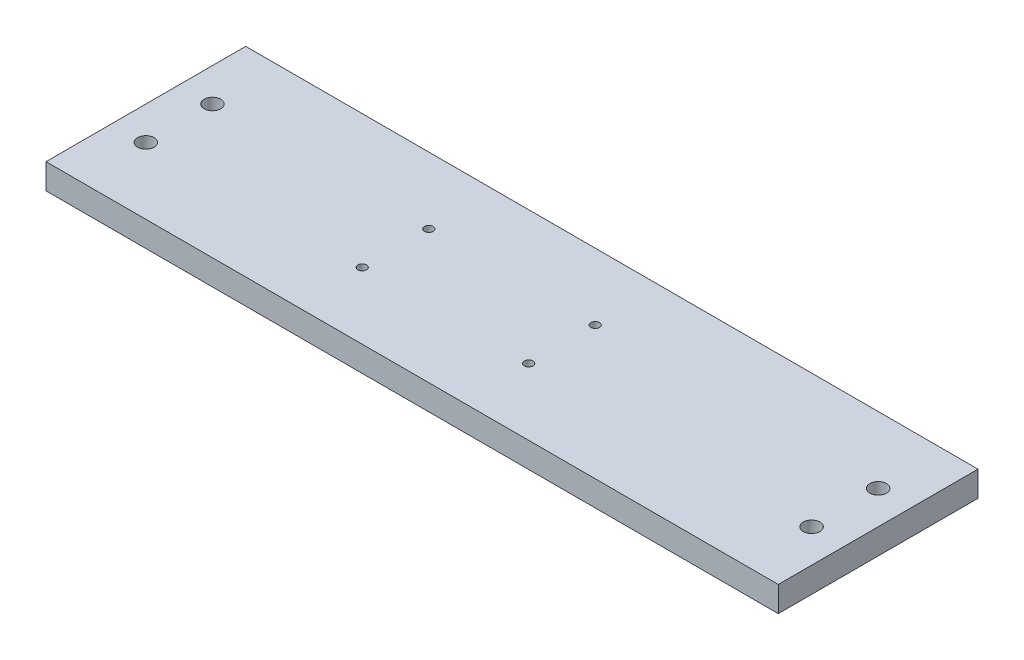
ISO-10303-21;
HEADER;
FILE_DESCRIPTION(('STEP AP214'),'2;1');
FILE_NAME('part.step','',(''),(''),'','','');
FILE_SCHEMA(('AUTOMOTIVE_DESIGN { 1 0 10303 214 1 1 1 1 }'));
ENDSEC;
DATA;
#1=APPLICATION_CONTEXT('core data for automotive mechanical design processes');
#2=APPLICATION_PROTOCOL_DEFINITION('international standard','automotive_design',2000,#1);
#3=PRODUCT_CONTEXT('',#1,'mechanical');
#4=PRODUCT('Part','Part','',(#3));
#5=PRODUCT_RELATED_PRODUCT_CATEGORY('part','',(#4));
#6=PRODUCT_DEFINITION_FORMATION('','',#4);
#7=PRODUCT_DEFINITION_CONTEXT('part definition',#1,'design');
#8=PRODUCT_DEFINITION('design','',#6,#7);
#9=PRODUCT_DEFINITION_SHAPE('','',#8);
#10=(LENGTH_UNIT() NAMED_UNIT(*) SI_UNIT(.MILLI.,.METRE.));
#11=(NAMED_UNIT(*) PLANE_ANGLE_UNIT() SI_UNIT($,.RADIAN.));
#12=(NAMED_UNIT(*) SI_UNIT($,.STERADIAN.) SOLID_ANGLE_UNIT());
#13=UNCERTAINTY_MEASURE_WITH_UNIT(LENGTH_MEASURE(1.E-05),#10,'distance_accuracy_value','');
#14=(GEOMETRIC_REPRESENTATION_CONTEXT(3) GLOBAL_UNCERTAINTY_ASSIGNED_CONTEXT((#13)) GLOBAL_UNIT_ASSIGNED_CONTEXT((#10,
#11,#12)) REPRESENTATION_CONTEXT('',''));
#15=CARTESIAN_POINT('',(0.,0.,0.));
#16=DIRECTION('',(0.,0.,1.));
#17=DIRECTION('',(1.,0.,0.));
#18=AXIS2_PLACEMENT_3D('',#15,#16,#17);
#19=CARTESIAN_POINT('',(0.,4.826,0.));
#20=DIRECTION('',(0.,-1.,0.));
#21=DIRECTION('',(0.,0.,-1.));
#22=AXIS2_PLACEMENT_3D('',#19,#20,#21);
#23=PLANE('',#22);
#24=DIRECTION('',(0.,0.,1.));
#25=VECTOR('',#24,1.);
#26=CARTESIAN_POINT('',(-139.7,4.826,-38.1));
#27=LINE('',#26,#25);
#28=CARTESIAN_POINT('',(-139.7,4.826,-38.1));
#29=VERTEX_POINT('',#28);
#30=CARTESIAN_POINT('',(-139.7,4.826,38.1));
#31=VERTEX_POINT('',#30);
#32=EDGE_CURVE('E91',#29,#31,#27,.T.);
#33=ORIENTED_EDGE('',*,*,#32,.T.);
#34=DIRECTION('',(1.,0.,0.));
#35=VECTOR('',#34,1.);
#36=CARTESIAN_POINT('',(139.7,4.826,38.1));
#37=LINE('',#36,#35);
#38=CARTESIAN_POINT('',(139.7,4.826,38.1));
#39=VERTEX_POINT('',#38);
#40=EDGE_CURVE('E86',#31,#39,#37,.T.);
#41=ORIENTED_EDGE('',*,*,#40,.T.);
#42=DIRECTION('',(0.,0.,-1.));
#43=VECTOR('',#42,1.);
#44=CARTESIAN_POINT('',(139.7,4.826,-38.1));
#45=LINE('',#44,#43);
#46=CARTESIAN_POINT('',(139.7,4.826,-38.1));
#47=VERTEX_POINT('',#46);
#48=EDGE_CURVE('E87',#39,#47,#45,.T.);
#49=ORIENTED_EDGE('',*,*,#48,.T.);
#50=DIRECTION('',(-1.,0.,0.));
#51=VECTOR('',#50,1.);
#52=CARTESIAN_POINT('',(139.7,4.826,-38.1));
#53=LINE('',#52,#51);
#54=EDGE_CURVE('E57',#47,#29,#53,.T.);
#55=ORIENTED_EDGE('',*,*,#54,.T.);
#56=EDGE_LOOP('',(#33,#41,#49,#55));
#57=FACE_BOUND('',#56,.T.);
#58=CARTESIAN_POINT('',(127.,4.826,-12.7));
#59=DIRECTION('',(0.,1.,0.));
#60=DIRECTION('',(0.,0.,1.));
#61=AXIS2_PLACEMENT_3D('',#58,#59,#60);
#62=CIRCLE('',#61,3.175);
#63=CARTESIAN_POINT('',(127.,4.826,-9.525));
#64=VERTEX_POINT('',#63);
#65=EDGE_CURVE('E106',#64,#64,#62,.T.);
#66=ORIENTED_EDGE('',*,*,#65,.F.);
#67=EDGE_LOOP('',(#66));
#68=FACE_BOUND('',#67,.T.);
#69=CARTESIAN_POINT('',(19.05,4.826,-12.7));
#70=DIRECTION('',(0.,1.,0.));
#71=DIRECTION('',(0.,0.,1.));
#72=AXIS2_PLACEMENT_3D('',#69,#70,#71);
#73=CIRCLE('',#72,1.651);
#74=CARTESIAN_POINT('',(19.05,4.826,-11.049));
#75=VERTEX_POINT('',#74);
#76=EDGE_CURVE('E123',#75,#75,#73,.T.);
#77=ORIENTED_EDGE('',*,*,#76,.F.);
#78=EDGE_LOOP('',(#77));
#79=FACE_BOUND('',#78,.T.);
#80=CARTESIAN_POINT('',(-44.45,4.826,-12.7));
#81=DIRECTION('',(0.,1.,0.));
#82=DIRECTION('',(0.,0.,1.));
#83=AXIS2_PLACEMENT_3D('',#80,#81,#82);
#84=CIRCLE('',#83,1.651);
#85=CARTESIAN_POINT('',(-44.45,4.826,-11.049));
#86=VERTEX_POINT('',#85);
#87=EDGE_CURVE('E130',#86,#86,#84,.T.);
#88=ORIENTED_EDGE('',*,*,#87,.F.);
#89=EDGE_LOOP('',(#88));
#90=FACE_BOUND('',#89,.T.);
#91=CARTESIAN_POINT('',(-127.,4.826,-12.7));
#92=DIRECTION('',(0.,1.,0.));
#93=DIRECTION('',(0.,0.,1.));
#94=AXIS2_PLACEMENT_3D('',#91,#92,#93);
#95=CIRCLE('',#94,3.175);
#96=CARTESIAN_POINT('',(-127.,4.826,-9.52499999999999));
#97=VERTEX_POINT('',#96);
#98=EDGE_CURVE('E133',#97,#97,#95,.T.);
#99=ORIENTED_EDGE('',*,*,#98,.F.);
#100=EDGE_LOOP('',(#99));
#101=FACE_BOUND('',#100,.T.);
#102=CARTESIAN_POINT('',(127.,4.826,12.7));
#103=DIRECTION('',(0.,1.,0.));
#104=DIRECTION('',(0.,0.,-1.));
#105=AXIS2_PLACEMENT_3D('',#102,#103,#104);
#106=CIRCLE('',#105,3.175);
#107=CARTESIAN_POINT('',(127.,4.826,9.525));
#108=VERTEX_POINT('',#107);
#109=EDGE_CURVE('E137',#108,#108,#106,.T.);
#110=ORIENTED_EDGE('',*,*,#109,.F.);
#111=EDGE_LOOP('',(#110));
#112=FACE_BOUND('',#111,.T.);
#113=CARTESIAN_POINT('',(19.05,4.826,12.7));
#114=DIRECTION('',(0.,1.,0.));
#115=DIRECTION('',(0.,0.,-1.));
#116=AXIS2_PLACEMENT_3D('',#113,#114,#115);
#117=CIRCLE('',#116,1.651);
#118=CARTESIAN_POINT('',(19.05,4.826,11.049));
#119=VERTEX_POINT('',#118);
#120=EDGE_CURVE('E144',#119,#119,#117,.T.);
#121=ORIENTED_EDGE('',*,*,#120,.F.);
#122=EDGE_LOOP('',(#121));
#123=FACE_BOUND('',#122,.T.);
#124=CARTESIAN_POINT('',(-44.45,4.826,12.7));
#125=DIRECTION('',(0.,1.,0.));
#126=DIRECTION('',(0.,0.,-1.));
#127=AXIS2_PLACEMENT_3D('',#124,#125,#126);
#128=CIRCLE('',#127,1.651);
#129=CARTESIAN_POINT('',(-44.45,4.826,11.049));
#130=VERTEX_POINT('',#129);
#131=EDGE_CURVE('E151',#130,#130,#128,.T.);
#132=ORIENTED_EDGE('',*,*,#131,.F.);
#133=EDGE_LOOP('',(#132));
#134=FACE_BOUND('',#133,.T.);
#135=CARTESIAN_POINT('',(-127.,4.826,12.7));
#136=DIRECTION('',(0.,1.,0.));
#137=DIRECTION('',(0.,0.,-1.));
#138=AXIS2_PLACEMENT_3D('',#135,#136,#137);
#139=CIRCLE('',#138,3.175);
#140=CARTESIAN_POINT('',(-127.,4.826,9.52499999999999));
#141=VERTEX_POINT('',#140);
#142=EDGE_CURVE('E160',#141,#141,#139,.T.);
#143=ORIENTED_EDGE('',*,*,#142,.F.);
#144=EDGE_LOOP('',(#143));
#145=FACE_BOUND('',#144,.T.);
#146=ADVANCED_FACE('F39',(#57,#68,#79,#90,#101,#112,#123,#134,#145),#23,.F.);
#147=CARTESIAN_POINT('',(0.,-4.826,0.));
#148=DIRECTION('',(0.,-1.,0.));
#149=DIRECTION('',(0.,0.,-1.));
#150=AXIS2_PLACEMENT_3D('',#147,#148,#149);
#151=PLANE('',#150);
#152=CARTESIAN_POINT('',(-44.45,-4.826,12.7));
#153=DIRECTION('',(0.,1.,0.));
#154=DIRECTION('',(0.,0.,-1.));
#155=AXIS2_PLACEMENT_3D('',#152,#153,#154);
#156=CIRCLE('',#155,1.651);
#157=CARTESIAN_POINT('',(-44.45,-4.826,11.049));
#158=VERTEX_POINT('',#157);
#159=EDGE_CURVE('E153',#158,#158,#156,.T.);
#160=ORIENTED_EDGE('',*,*,#159,.T.);
#161=EDGE_LOOP('',(#160));
#162=FACE_BOUND('',#161,.T.);
#163=CARTESIAN_POINT('',(127.,-4.826,12.7));
#164=DIRECTION('',(0.,1.,0.));
#165=DIRECTION('',(0.,0.,-1.));
#166=AXIS2_PLACEMENT_3D('',#163,#164,#165);
#167=CIRCLE('',#166,3.175);
#168=CARTESIAN_POINT('',(127.,-4.826,9.525));
#169=VERTEX_POINT('',#168);
#170=EDGE_CURVE('E145',#169,#169,#167,.T.);
#171=ORIENTED_EDGE('',*,*,#170,.T.);
#172=EDGE_LOOP('',(#171));
#173=FACE_BOUND('',#172,.T.);
#174=CARTESIAN_POINT('',(-44.45,-4.826,-12.7));
#175=DIRECTION('',(0.,1.,0.));
#176=DIRECTION('',(0.,0.,1.));
#177=AXIS2_PLACEMENT_3D('',#174,#175,#176);
#178=CIRCLE('',#177,1.651);
#179=CARTESIAN_POINT('',(-44.45,-4.826,-11.049));
#180=VERTEX_POINT('',#179);
#181=EDGE_CURVE('E127',#180,#180,#178,.T.);
#182=ORIENTED_EDGE('',*,*,#181,.T.);
#183=EDGE_LOOP('',(#182));
#184=FACE_BOUND('',#183,.T.);
#185=CARTESIAN_POINT('',(127.,-4.826,-12.7));
#186=DIRECTION('',(0.,1.,0.));
#187=DIRECTION('',(0.,0.,1.));
#188=AXIS2_PLACEMENT_3D('',#185,#186,#187);
#189=CIRCLE('',#188,3.175);
#190=CARTESIAN_POINT('',(127.,-4.826,-9.525));
#191=VERTEX_POINT('',#190);
#192=EDGE_CURVE('E119',#191,#191,#189,.T.);
#193=ORIENTED_EDGE('',*,*,#192,.T.);
#194=EDGE_LOOP('',(#193));
#195=FACE_BOUND('',#194,.T.);
#196=DIRECTION('',(0.,0.,1.));
#197=VECTOR('',#196,1.);
#198=CARTESIAN_POINT('',(-139.7,-4.826,-38.1));
#199=LINE('',#198,#197);
#200=CARTESIAN_POINT('',(-139.7,-4.826,-38.1));
#201=VERTEX_POINT('',#200);
#202=CARTESIAN_POINT('',(-139.7,-4.826,38.1));
#203=VERTEX_POINT('',#202);
#204=EDGE_CURVE('E104',#201,#203,#199,.T.);
#205=ORIENTED_EDGE('',*,*,#204,.F.);
#206=DIRECTION('',(-1.,0.,0.));
#207=VECTOR('',#206,1.);
#208=CARTESIAN_POINT('',(139.7,-4.826,-38.1));
#209=LINE('',#208,#207);
#210=CARTESIAN_POINT('',(139.7,-4.826,-38.1));
#211=VERTEX_POINT('',#210);
#212=EDGE_CURVE('E80',#211,#201,#209,.T.);
#213=ORIENTED_EDGE('',*,*,#212,.F.);
#214=DIRECTION('',(0.,0.,-1.));
#215=VECTOR('',#214,1.);
#216=CARTESIAN_POINT('',(139.7,-4.826,-38.1));
#217=LINE('',#216,#215);
#218=CARTESIAN_POINT('',(139.7,-4.826,38.1));
#219=VERTEX_POINT('',#218);
#220=EDGE_CURVE('E74',#219,#211,#217,.T.);
#221=ORIENTED_EDGE('',*,*,#220,.F.);
#222=DIRECTION('',(1.,0.,0.));
#223=VECTOR('',#222,1.);
#224=CARTESIAN_POINT('',(139.7,-4.826,38.1));
#225=LINE('',#224,#223);
#226=EDGE_CURVE('E94',#203,#219,#225,.T.);
#227=ORIENTED_EDGE('',*,*,#226,.F.);
#228=EDGE_LOOP('',(#205,#213,#221,#227));
#229=FACE_BOUND('',#228,.T.);
#230=CARTESIAN_POINT('',(19.05,-4.826,-12.7));
#231=DIRECTION('',(0.,1.,0.));
#232=DIRECTION('',(0.,0.,1.));
#233=AXIS2_PLACEMENT_3D('',#230,#231,#232);
#234=CIRCLE('',#233,1.651);
#235=CARTESIAN_POINT('',(19.05,-4.826,-11.049));
#236=VERTEX_POINT('',#235);
#237=EDGE_CURVE('E125',#236,#236,#234,.T.);
#238=ORIENTED_EDGE('',*,*,#237,.T.);
#239=EDGE_LOOP('',(#238));
#240=FACE_BOUND('',#239,.T.);
#241=CARTESIAN_POINT('',(-127.,-4.826,-12.7));
#242=DIRECTION('',(0.,1.,0.));
#243=DIRECTION('',(0.,0.,1.));
#244=AXIS2_PLACEMENT_3D('',#241,#242,#243);
#245=CIRCLE('',#244,3.175);
#246=CARTESIAN_POINT('',(-127.,-4.826,-9.52499999999999));
#247=VERTEX_POINT('',#246);
#248=EDGE_CURVE('E136',#247,#247,#245,.T.);
#249=ORIENTED_EDGE('',*,*,#248,.T.);
#250=EDGE_LOOP('',(#249));
#251=FACE_BOUND('',#250,.T.);
#252=CARTESIAN_POINT('',(19.05,-4.826,12.7));
#253=DIRECTION('',(0.,1.,0.));
#254=DIRECTION('',(0.,0.,-1.));
#255=AXIS2_PLACEMENT_3D('',#252,#253,#254);
#256=CIRCLE('',#255,1.651);
#257=CARTESIAN_POINT('',(19.05,-4.826,11.049));
#258=VERTEX_POINT('',#257);
#259=EDGE_CURVE('E149',#258,#258,#256,.T.);
#260=ORIENTED_EDGE('',*,*,#259,.T.);
#261=EDGE_LOOP('',(#260));
#262=FACE_BOUND('',#261,.T.);
#263=CARTESIAN_POINT('',(-127.,-4.826,12.7));
#264=DIRECTION('',(0.,1.,0.));
#265=DIRECTION('',(0.,0.,-1.));
#266=AXIS2_PLACEMENT_3D('',#263,#264,#265);
#267=CIRCLE('',#266,3.175);
#268=CARTESIAN_POINT('',(-127.,-4.826,9.52499999999999));
#269=VERTEX_POINT('',#268);
#270=EDGE_CURVE('E158',#269,#269,#267,.T.);
#271=ORIENTED_EDGE('',*,*,#270,.T.);
#272=EDGE_LOOP('',(#271));
#273=FACE_BOUND('',#272,.T.);
#274=ADVANCED_FACE('F114',(#162,#173,#184,#195,#229,#240,#251,#262,#273),#151,.T.);
#275=CARTESIAN_POINT('',(-139.7,4.826,-38.1));
#276=DIRECTION('',(1.,0.,0.));
#277=DIRECTION('',(0.,0.,-1.));
#278=AXIS2_PLACEMENT_3D('',#275,#276,#277);
#279=PLANE('',#278);
#280=ORIENTED_EDGE('',*,*,#204,.T.);
#281=DIRECTION('',(0.,-1.,0.));
#282=VECTOR('',#281,1.);
#283=CARTESIAN_POINT('',(-139.7,4.826,38.1));
#284=LINE('',#283,#282);
#285=EDGE_CURVE('E11',#31,#203,#284,.T.);
#286=ORIENTED_EDGE('',*,*,#285,.F.);
#287=ORIENTED_EDGE('',*,*,#32,.F.);
#288=DIRECTION('',(0.,-1.,0.));
#289=VECTOR('',#288,1.);
#290=CARTESIAN_POINT('',(-139.7,4.826,-38.1));
#291=LINE('',#290,#289);
#292=EDGE_CURVE('E98',#29,#201,#291,.T.);
#293=ORIENTED_EDGE('',*,*,#292,.T.);
#294=EDGE_LOOP('',(#280,#286,#287,#293));
#295=FACE_BOUND('',#294,.T.);
#296=ADVANCED_FACE('F41',(#295),#279,.F.);
#297=CARTESIAN_POINT('',(139.7,4.826,38.1));
#298=DIRECTION('',(0.,0.,-1.));
#299=DIRECTION('',(-1.,0.,0.));
#300=AXIS2_PLACEMENT_3D('',#297,#298,#299);
#301=PLANE('',#300);
#302=ORIENTED_EDGE('',*,*,#226,.T.);
#303=DIRECTION('',(0.,-1.,0.));
#304=VECTOR('',#303,1.);
#305=CARTESIAN_POINT('',(139.7,4.826,38.1));
#306=LINE('',#305,#304);
#307=EDGE_CURVE('E48',#39,#219,#306,.T.);
#308=ORIENTED_EDGE('',*,*,#307,.F.);
#309=ORIENTED_EDGE('',*,*,#40,.F.);
#310=ORIENTED_EDGE('',*,*,#285,.T.);
#311=EDGE_LOOP('',(#302,#308,#309,#310));
#312=FACE_BOUND('',#311,.T.);
#313=ADVANCED_FACE('F92',(#312),#301,.F.);
#314=CARTESIAN_POINT('',(139.7,4.826,-38.1));
#315=DIRECTION('',(-1.,0.,0.));
#316=DIRECTION('',(0.,0.,1.));
#317=AXIS2_PLACEMENT_3D('',#314,#315,#316);
#318=PLANE('',#317);
#319=ORIENTED_EDGE('',*,*,#220,.T.);
#320=DIRECTION('',(0.,-1.,0.));
#321=VECTOR('',#320,1.);
#322=CARTESIAN_POINT('',(139.7,4.826,-38.1));
#323=LINE('',#322,#321);
#324=EDGE_CURVE('E96',#47,#211,#323,.T.);
#325=ORIENTED_EDGE('',*,*,#324,.F.);
#326=ORIENTED_EDGE('',*,*,#48,.F.);
#327=ORIENTED_EDGE('',*,*,#307,.T.);
#328=EDGE_LOOP('',(#319,#325,#326,#327));
#329=FACE_BOUND('',#328,.T.);
#330=ADVANCED_FACE('F100',(#329),#318,.F.);
#331=CARTESIAN_POINT('',(139.7,4.826,-38.1));
#332=DIRECTION('',(0.,0.,1.));
#333=DIRECTION('',(1.,0.,0.));
#334=AXIS2_PLACEMENT_3D('',#331,#332,#333);
#335=PLANE('',#334);
#336=ORIENTED_EDGE('',*,*,#212,.T.);
#337=ORIENTED_EDGE('',*,*,#292,.F.);
#338=ORIENTED_EDGE('',*,*,#54,.F.);
#339=ORIENTED_EDGE('',*,*,#324,.T.);
#340=EDGE_LOOP('',(#336,#337,#338,#339));
#341=FACE_BOUND('',#340,.T.);
#342=ADVANCED_FACE('F112',(#341),#335,.F.);
#343=CARTESIAN_POINT('',(127.,4.826,-12.7));
#344=DIRECTION('',(0.,-1.,0.));
#345=DIRECTION('',(0.,0.,-1.));
#346=AXIS2_PLACEMENT_3D('',#343,#344,#345);
#347=CYLINDRICAL_SURFACE('',#346,3.175);
#348=ORIENTED_EDGE('',*,*,#65,.T.);
#349=EDGE_LOOP('',(#348));
#350=FACE_BOUND('',#349,.T.);
#351=ORIENTED_EDGE('',*,*,#192,.F.);
#352=EDGE_LOOP('',(#351));
#353=FACE_BOUND('',#352,.T.);
#354=ADVANCED_FACE('F180',(#350,#353),#347,.F.);
#355=CARTESIAN_POINT('',(19.05,4.826,-12.7));
#356=DIRECTION('',(0.,-1.,0.));
#357=DIRECTION('',(0.,0.,-1.));
#358=AXIS2_PLACEMENT_3D('',#355,#356,#357);
#359=CYLINDRICAL_SURFACE('',#358,1.651);
#360=ORIENTED_EDGE('',*,*,#76,.T.);
#361=EDGE_LOOP('',(#360));
#362=FACE_BOUND('',#361,.T.);
#363=ORIENTED_EDGE('',*,*,#237,.F.);
#364=EDGE_LOOP('',(#363));
#365=FACE_BOUND('',#364,.T.);
#366=ADVANCED_FACE('F225',(#362,#365),#359,.F.);
#367=CARTESIAN_POINT('',(-44.45,4.826,-12.7));
#368=DIRECTION('',(0.,-1.,0.));
#369=DIRECTION('',(0.,0.,-1.));
#370=AXIS2_PLACEMENT_3D('',#367,#368,#369);
#371=CYLINDRICAL_SURFACE('',#370,1.651);
#372=ORIENTED_EDGE('',*,*,#87,.T.);
#373=EDGE_LOOP('',(#372));
#374=FACE_BOUND('',#373,.T.);
#375=ORIENTED_EDGE('',*,*,#181,.F.);
#376=EDGE_LOOP('',(#375));
#377=FACE_BOUND('',#376,.T.);
#378=ADVANCED_FACE('F229',(#374,#377),#371,.F.);
#379=CARTESIAN_POINT('',(-127.,4.826,-12.7));
#380=DIRECTION('',(0.,-1.,0.));
#381=DIRECTION('',(0.,0.,-1.));
#382=AXIS2_PLACEMENT_3D('',#379,#380,#381);
#383=CYLINDRICAL_SURFACE('',#382,3.175);
#384=ORIENTED_EDGE('',*,*,#98,.T.);
#385=EDGE_LOOP('',(#384));
#386=FACE_BOUND('',#385,.T.);
#387=ORIENTED_EDGE('',*,*,#248,.F.);
#388=EDGE_LOOP('',(#387));
#389=FACE_BOUND('',#388,.T.);
#390=ADVANCED_FACE('F239',(#386,#389),#383,.F.);
#391=CARTESIAN_POINT('',(127.,4.826,12.7));
#392=DIRECTION('',(0.,-1.,0.));
#393=DIRECTION('',(0.,0.,-1.));
#394=AXIS2_PLACEMENT_3D('',#391,#392,#393);
#395=CYLINDRICAL_SURFACE('',#394,3.175);
#396=ORIENTED_EDGE('',*,*,#109,.T.);
#397=EDGE_LOOP('',(#396));
#398=FACE_BOUND('',#397,.T.);
#399=ORIENTED_EDGE('',*,*,#170,.F.);
#400=EDGE_LOOP('',(#399));
#401=FACE_BOUND('',#400,.T.);
#402=ADVANCED_FACE('F250',(#398,#401),#395,.F.);
#403=CARTESIAN_POINT('',(19.05,4.826,12.7));
#404=DIRECTION('',(0.,-1.,0.));
#405=DIRECTION('',(0.,0.,-1.));
#406=AXIS2_PLACEMENT_3D('',#403,#404,#405);
#407=CYLINDRICAL_SURFACE('',#406,1.651);
#408=ORIENTED_EDGE('',*,*,#120,.T.);
#409=EDGE_LOOP('',(#408));
#410=FACE_BOUND('',#409,.T.);
#411=ORIENTED_EDGE('',*,*,#259,.F.);
#412=EDGE_LOOP('',(#411));
#413=FACE_BOUND('',#412,.T.);
#414=ADVANCED_FACE('F258',(#410,#413),#407,.F.);
#415=CARTESIAN_POINT('',(-44.45,4.826,12.7));
#416=DIRECTION('',(0.,-1.,0.));
#417=DIRECTION('',(0.,0.,-1.));
#418=AXIS2_PLACEMENT_3D('',#415,#416,#417);
#419=CYLINDRICAL_SURFACE('',#418,1.651);
#420=ORIENTED_EDGE('',*,*,#131,.T.);
#421=EDGE_LOOP('',(#420));
#422=FACE_BOUND('',#421,.T.);
#423=ORIENTED_EDGE('',*,*,#159,.F.);
#424=EDGE_LOOP('',(#423));
#425=FACE_BOUND('',#424,.T.);
#426=ADVANCED_FACE('F262',(#422,#425),#419,.F.);
#427=CARTESIAN_POINT('',(-127.,4.826,12.7));
#428=DIRECTION('',(0.,-1.,0.));
#429=DIRECTION('',(0.,0.,-1.));
#430=AXIS2_PLACEMENT_3D('',#427,#428,#429);
#431=CYLINDRICAL_SURFACE('',#430,3.175);
#432=ORIENTED_EDGE('',*,*,#142,.T.);
#433=EDGE_LOOP('',(#432));
#434=FACE_BOUND('',#433,.T.);
#435=ORIENTED_EDGE('',*,*,#270,.F.);
#436=EDGE_LOOP('',(#435));
#437=FACE_BOUND('',#436,.T.);
#438=ADVANCED_FACE('F168',(#434,#437),#431,.F.);
#439=CLOSED_SHELL('',(#146,#274,#296,#313,#330,#342,#354,#366,#378,#390,#402,#414,#426,#438));
#440=MANIFOLD_SOLID_BREP('B2',#439);
#441=ADVANCED_BREP_SHAPE_REPRESENTATION('',(#18,#440),#14);
#442=SHAPE_DEFINITION_REPRESENTATION(#9,#441);
ENDSEC;
END-ISO-10303-21;
